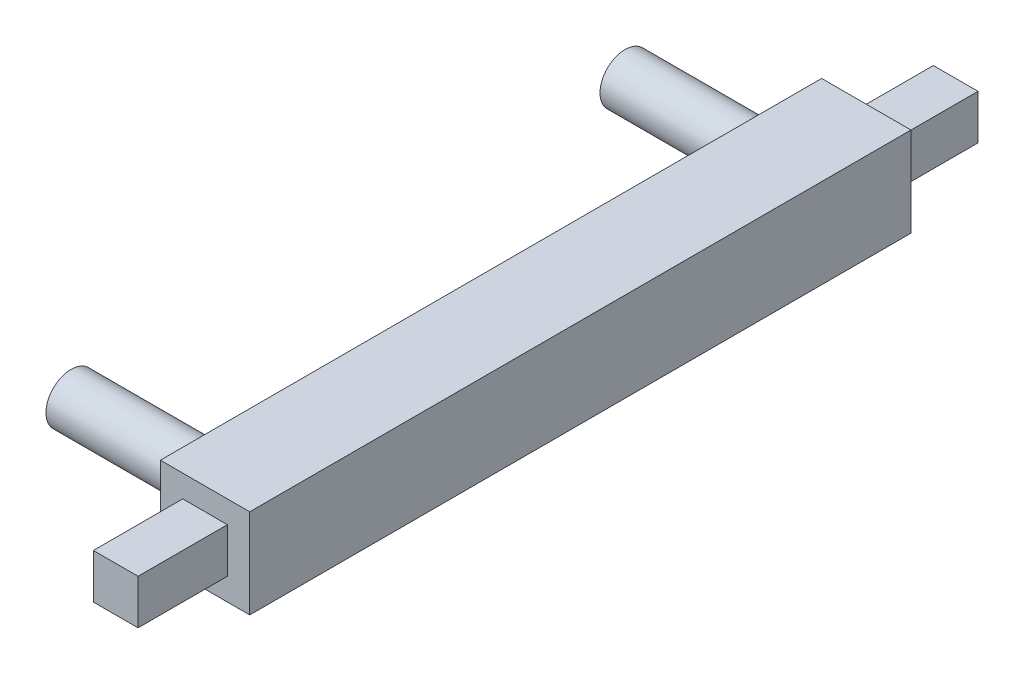
ISO-10303-21;
HEADER;
FILE_DESCRIPTION(('STEP AP214'),'2;1');
FILE_NAME('part.step','',(''),(''),'','','');
FILE_SCHEMA(('AUTOMOTIVE_DESIGN { 1 0 10303 214 1 1 1 1 }'));
ENDSEC;
DATA;
#1=APPLICATION_CONTEXT('core data for automotive mechanical design processes');
#2=APPLICATION_PROTOCOL_DEFINITION('international standard','automotive_design',2000,#1);
#3=PRODUCT_CONTEXT('',#1,'mechanical');
#4=PRODUCT('Part','Part','',(#3));
#5=PRODUCT_RELATED_PRODUCT_CATEGORY('part','',(#4));
#6=PRODUCT_DEFINITION_FORMATION('','',#4);
#7=PRODUCT_DEFINITION_CONTEXT('part definition',#1,'design');
#8=PRODUCT_DEFINITION('design','',#6,#7);
#9=PRODUCT_DEFINITION_SHAPE('','',#8);
#10=(LENGTH_UNIT() NAMED_UNIT(*) SI_UNIT(.MILLI.,.METRE.));
#11=(NAMED_UNIT(*) PLANE_ANGLE_UNIT() SI_UNIT($,.RADIAN.));
#12=(NAMED_UNIT(*) SI_UNIT($,.STERADIAN.) SOLID_ANGLE_UNIT());
#13=UNCERTAINTY_MEASURE_WITH_UNIT(LENGTH_MEASURE(1.E-05),#10,'distance_accuracy_value','');
#14=(GEOMETRIC_REPRESENTATION_CONTEXT(3) GLOBAL_UNCERTAINTY_ASSIGNED_CONTEXT((#13)) GLOBAL_UNIT_ASSIGNED_CONTEXT((#10,
#11,#12)) REPRESENTATION_CONTEXT('',''));
#15=CARTESIAN_POINT('',(0.,0.,0.));
#16=DIRECTION('',(0.,0.,1.));
#17=DIRECTION('',(1.,0.,0.));
#18=AXIS2_PLACEMENT_3D('',#15,#16,#17);
#19=CARTESIAN_POINT('',(0.,0.,37.));
#20=DIRECTION('',(0.,0.,-1.));
#21=DIRECTION('',(-1.,0.,0.));
#22=AXIS2_PLACEMENT_3D('',#19,#20,#21);
#23=PLANE('',#22);
#24=DIRECTION('',(0.,-1.,0.));
#25=VECTOR('',#24,1.);
#26=CARTESIAN_POINT('',(0.,0.,37.));
#27=LINE('',#26,#25);
#28=CARTESIAN_POINT('',(0.,5.,37.));
#29=VERTEX_POINT('',#28);
#30=CARTESIAN_POINT('',(0.,0.,37.));
#31=VERTEX_POINT('',#30);
#32=EDGE_CURVE('E180',#29,#31,#27,.T.);
#33=ORIENTED_EDGE('',*,*,#32,.T.);
#34=DIRECTION('',(1.,0.,0.));
#35=VECTOR('',#34,1.);
#36=CARTESIAN_POINT('',(0.,0.,37.));
#37=LINE('',#36,#35);
#38=CARTESIAN_POINT('',(5.,0.,37.));
#39=VERTEX_POINT('',#38);
#40=EDGE_CURVE('E183',#31,#39,#37,.T.);
#41=ORIENTED_EDGE('',*,*,#40,.T.);
#42=DIRECTION('',(0.,1.,0.));
#43=VECTOR('',#42,1.);
#44=CARTESIAN_POINT('',(5.,0.,37.));
#45=LINE('',#44,#43);
#46=CARTESIAN_POINT('',(5.,5.,37.));
#47=VERTEX_POINT('',#46);
#48=EDGE_CURVE('E186',#39,#47,#45,.T.);
#49=ORIENTED_EDGE('',*,*,#48,.T.);
#50=DIRECTION('',(-1.,0.,0.));
#51=VECTOR('',#50,1.);
#52=CARTESIAN_POINT('',(0.,5.,37.));
#53=LINE('',#52,#51);
#54=EDGE_CURVE('E188',#47,#29,#53,.T.);
#55=ORIENTED_EDGE('',*,*,#54,.T.);
#56=EDGE_LOOP('',(#33,#41,#49,#55));
#57=FACE_BOUND('',#56,.T.);
#58=DIRECTION('',(0.,-1.,0.));
#59=VECTOR('',#58,1.);
#60=CARTESIAN_POINT('',(1.25,1.25,37.));
#61=LINE('',#60,#59);
#62=CARTESIAN_POINT('',(1.25,3.75,37.));
#63=VERTEX_POINT('',#62);
#64=CARTESIAN_POINT('',(1.25,1.25,37.));
#65=VERTEX_POINT('',#64);
#66=EDGE_CURVE('E141',#63,#65,#61,.T.);
#67=ORIENTED_EDGE('',*,*,#66,.F.);
#68=DIRECTION('',(-1.,0.,0.));
#69=VECTOR('',#68,1.);
#70=CARTESIAN_POINT('',(1.25,3.75,37.));
#71=LINE('',#70,#69);
#72=CARTESIAN_POINT('',(3.75,3.75,37.));
#73=VERTEX_POINT('',#72);
#74=EDGE_CURVE('E154',#73,#63,#71,.T.);
#75=ORIENTED_EDGE('',*,*,#74,.F.);
#76=DIRECTION('',(0.,1.,0.));
#77=VECTOR('',#76,1.);
#78=CARTESIAN_POINT('',(3.75,1.25,37.));
#79=LINE('',#78,#77);
#80=CARTESIAN_POINT('',(3.75,1.25,37.));
#81=VERTEX_POINT('',#80);
#82=EDGE_CURVE('E163',#81,#73,#79,.T.);
#83=ORIENTED_EDGE('',*,*,#82,.F.);
#84=DIRECTION('',(1.,0.,0.));
#85=VECTOR('',#84,1.);
#86=CARTESIAN_POINT('',(1.25,1.25,37.));
#87=LINE('',#86,#85);
#88=EDGE_CURVE('E144',#65,#81,#87,.T.);
#89=ORIENTED_EDGE('',*,*,#88,.F.);
#90=EDGE_LOOP('',(#67,#75,#83,#89));
#91=FACE_BOUND('',#90,.T.);
#92=ADVANCED_FACE('F32',(#57,#91),#23,.F.);
#93=CARTESIAN_POINT('',(0.,0.,37.));
#94=DIRECTION('',(1.,0.,0.));
#95=DIRECTION('',(0.,0.,-1.));
#96=AXIS2_PLACEMENT_3D('',#93,#94,#95);
#97=PLANE('',#96);
#98=CARTESIAN_POINT('',(0.,2.5,34.));
#99=DIRECTION('',(1.,0.,0.));
#100=DIRECTION('',(0.,0.,-1.));
#101=AXIS2_PLACEMENT_3D('',#98,#99,#100);
#102=CIRCLE('',#101,1.4);
#103=CARTESIAN_POINT('',(0.,2.5,32.6));
#104=VERTEX_POINT('',#103);
#105=EDGE_CURVE('E11',#104,#104,#102,.F.);
#106=ORIENTED_EDGE('',*,*,#105,.F.);
#107=EDGE_LOOP('',(#106));
#108=FACE_BOUND('',#107,.T.);
#109=CARTESIAN_POINT('',(0.,2.5,3.));
#110=DIRECTION('',(1.,0.,0.));
#111=DIRECTION('',(0.,0.,-1.));
#112=AXIS2_PLACEMENT_3D('',#109,#110,#111);
#113=CIRCLE('',#112,1.4);
#114=CARTESIAN_POINT('',(0.,2.5,1.6));
#115=VERTEX_POINT('',#114);
#116=EDGE_CURVE('E40',#115,#115,#113,.F.);
#117=ORIENTED_EDGE('',*,*,#116,.F.);
#118=EDGE_LOOP('',(#117));
#119=FACE_BOUND('',#118,.T.);
#120=DIRECTION('',(0.,-1.,0.));
#121=VECTOR('',#120,1.);
#122=CARTESIAN_POINT('',(0.,0.,0.));
#123=LINE('',#122,#121);
#124=CARTESIAN_POINT('',(0.,5.,0.));
#125=VERTEX_POINT('',#124);
#126=CARTESIAN_POINT('',(0.,0.,0.));
#127=VERTEX_POINT('',#126);
#128=EDGE_CURVE('E179',#125,#127,#123,.T.);
#129=ORIENTED_EDGE('',*,*,#128,.T.);
#130=DIRECTION('',(0.,0.,-1.));
#131=VECTOR('',#130,1.);
#132=CARTESIAN_POINT('',(0.,0.,37.));
#133=LINE('',#132,#131);
#134=EDGE_CURVE('E206',#31,#127,#133,.T.);
#135=ORIENTED_EDGE('',*,*,#134,.F.);
#136=ORIENTED_EDGE('',*,*,#32,.F.);
#137=DIRECTION('',(0.,0.,-1.));
#138=VECTOR('',#137,1.);
#139=CARTESIAN_POINT('',(0.,5.,37.));
#140=LINE('',#139,#138);
#141=EDGE_CURVE('E190',#29,#125,#140,.T.);
#142=ORIENTED_EDGE('',*,*,#141,.T.);
#143=EDGE_LOOP('',(#129,#135,#136,#142));
#144=FACE_BOUND('',#143,.T.);
#145=ADVANCED_FACE('F34',(#108,#119,#144),#97,.F.);
#146=CARTESIAN_POINT('',(0.,0.,37.));
#147=DIRECTION('',(0.,1.,0.));
#148=DIRECTION('',(0.,0.,1.));
#149=AXIS2_PLACEMENT_3D('',#146,#147,#148);
#150=PLANE('',#149);
#151=DIRECTION('',(1.,0.,0.));
#152=VECTOR('',#151,1.);
#153=CARTESIAN_POINT('',(0.,0.,0.));
#154=LINE('',#153,#152);
#155=CARTESIAN_POINT('',(5.,0.,0.));
#156=VERTEX_POINT('',#155);
#157=EDGE_CURVE('E193',#127,#156,#154,.T.);
#158=ORIENTED_EDGE('',*,*,#157,.T.);
#159=DIRECTION('',(0.,0.,-1.));
#160=VECTOR('',#159,1.);
#161=CARTESIAN_POINT('',(5.,0.,37.));
#162=LINE('',#161,#160);
#163=EDGE_CURVE('E203',#39,#156,#162,.T.);
#164=ORIENTED_EDGE('',*,*,#163,.F.);
#165=ORIENTED_EDGE('',*,*,#40,.F.);
#166=ORIENTED_EDGE('',*,*,#134,.T.);
#167=EDGE_LOOP('',(#158,#164,#165,#166));
#168=FACE_BOUND('',#167,.T.);
#169=ADVANCED_FACE('F215',(#168),#150,.F.);
#170=CARTESIAN_POINT('',(5.,0.,37.));
#171=DIRECTION('',(-1.,0.,0.));
#172=DIRECTION('',(0.,0.,1.));
#173=AXIS2_PLACEMENT_3D('',#170,#171,#172);
#174=PLANE('',#173);
#175=DIRECTION('',(0.,1.,0.));
#176=VECTOR('',#175,1.);
#177=CARTESIAN_POINT('',(5.,0.,0.));
#178=LINE('',#177,#176);
#179=CARTESIAN_POINT('',(5.,5.,0.));
#180=VERTEX_POINT('',#179);
#181=EDGE_CURVE('E195',#156,#180,#178,.T.);
#182=ORIENTED_EDGE('',*,*,#181,.T.);
#183=DIRECTION('',(0.,0.,-1.));
#184=VECTOR('',#183,1.);
#185=CARTESIAN_POINT('',(5.,5.,37.));
#186=LINE('',#185,#184);
#187=EDGE_CURVE('E200',#47,#180,#186,.T.);
#188=ORIENTED_EDGE('',*,*,#187,.F.);
#189=ORIENTED_EDGE('',*,*,#48,.F.);
#190=ORIENTED_EDGE('',*,*,#163,.T.);
#191=EDGE_LOOP('',(#182,#188,#189,#190));
#192=FACE_BOUND('',#191,.T.);
#193=ADVANCED_FACE('F235',(#192),#174,.F.);
#194=CARTESIAN_POINT('',(0.,5.,37.));
#195=DIRECTION('',(0.,-1.,0.));
#196=DIRECTION('',(0.,0.,-1.));
#197=AXIS2_PLACEMENT_3D('',#194,#195,#196);
#198=PLANE('',#197);
#199=DIRECTION('',(-1.,0.,0.));
#200=VECTOR('',#199,1.);
#201=CARTESIAN_POINT('',(0.,5.,0.));
#202=LINE('',#201,#200);
#203=EDGE_CURVE('E184',#180,#125,#202,.T.);
#204=ORIENTED_EDGE('',*,*,#203,.T.);
#205=ORIENTED_EDGE('',*,*,#141,.F.);
#206=ORIENTED_EDGE('',*,*,#54,.F.);
#207=ORIENTED_EDGE('',*,*,#187,.T.);
#208=EDGE_LOOP('',(#204,#205,#206,#207));
#209=FACE_BOUND('',#208,.T.);
#210=ADVANCED_FACE('F233',(#209),#198,.F.);
#211=CARTESIAN_POINT('',(0.,0.,0.));
#212=DIRECTION('',(0.,0.,-1.));
#213=DIRECTION('',(-1.,0.,0.));
#214=AXIS2_PLACEMENT_3D('',#211,#212,#213);
#215=PLANE('',#214);
#216=DIRECTION('',(0.,-1.,0.));
#217=VECTOR('',#216,1.);
#218=CARTESIAN_POINT('',(3.75,1.25,0.));
#219=LINE('',#218,#217);
#220=CARTESIAN_POINT('',(3.75,3.75,0.));
#221=VERTEX_POINT('',#220);
#222=CARTESIAN_POINT('',(3.75,1.25,0.));
#223=VERTEX_POINT('',#222);
#224=EDGE_CURVE('E47',#221,#223,#219,.T.);
#225=ORIENTED_EDGE('',*,*,#224,.F.);
#226=DIRECTION('',(1.,0.,0.));
#227=VECTOR('',#226,1.);
#228=CARTESIAN_POINT('',(3.75,3.75,0.));
#229=LINE('',#228,#227);
#230=CARTESIAN_POINT('',(1.25,3.75,0.));
#231=VERTEX_POINT('',#230);
#232=EDGE_CURVE('E51',#231,#221,#229,.T.);
#233=ORIENTED_EDGE('',*,*,#232,.F.);
#234=DIRECTION('',(0.,1.,0.));
#235=VECTOR('',#234,1.);
#236=CARTESIAN_POINT('',(1.25,1.25,0.));
#237=LINE('',#236,#235);
#238=CARTESIAN_POINT('',(1.25,1.25,0.));
#239=VERTEX_POINT('',#238);
#240=EDGE_CURVE('E397',#239,#231,#237,.T.);
#241=ORIENTED_EDGE('',*,*,#240,.F.);
#242=DIRECTION('',(-1.,0.,0.));
#243=VECTOR('',#242,1.);
#244=CARTESIAN_POINT('',(3.75,1.25,0.));
#245=LINE('',#244,#243);
#246=EDGE_CURVE('E395',#223,#239,#245,.T.);
#247=ORIENTED_EDGE('',*,*,#246,.F.);
#248=EDGE_LOOP('',(#225,#233,#241,#247));
#249=FACE_BOUND('',#248,.T.);
#250=ORIENTED_EDGE('',*,*,#128,.F.);
#251=ORIENTED_EDGE('',*,*,#203,.F.);
#252=ORIENTED_EDGE('',*,*,#181,.F.);
#253=ORIENTED_EDGE('',*,*,#157,.F.);
#254=EDGE_LOOP('',(#250,#251,#252,#253));
#255=FACE_BOUND('',#254,.T.);
#256=ADVANCED_FACE('F223',(#249,#255),#215,.T.);
#257=CARTESIAN_POINT('',(1.25,1.25,42.));
#258=DIRECTION('',(1.,0.,0.));
#259=DIRECTION('',(0.,0.,-1.));
#260=AXIS2_PLACEMENT_3D('',#257,#258,#259);
#261=PLANE('',#260);
#262=ORIENTED_EDGE('',*,*,#66,.T.);
#263=DIRECTION('',(0.,0.,-1.));
#264=VECTOR('',#263,1.);
#265=CARTESIAN_POINT('',(1.25,1.25,42.));
#266=LINE('',#265,#264);
#267=CARTESIAN_POINT('',(1.25,1.25,42.));
#268=VERTEX_POINT('',#267);
#269=EDGE_CURVE('E176',#268,#65,#266,.T.);
#270=ORIENTED_EDGE('',*,*,#269,.F.);
#271=DIRECTION('',(0.,-1.,0.));
#272=VECTOR('',#271,1.);
#273=CARTESIAN_POINT('',(1.25,1.25,42.));
#274=LINE('',#273,#272);
#275=CARTESIAN_POINT('',(1.25,3.75,42.));
#276=VERTEX_POINT('',#275);
#277=EDGE_CURVE('E150',#276,#268,#274,.T.);
#278=ORIENTED_EDGE('',*,*,#277,.F.);
#279=DIRECTION('',(0.,0.,-1.));
#280=VECTOR('',#279,1.);
#281=CARTESIAN_POINT('',(1.25,3.75,42.));
#282=LINE('',#281,#280);
#283=EDGE_CURVE('E159',#276,#63,#282,.T.);
#284=ORIENTED_EDGE('',*,*,#283,.T.);
#285=EDGE_LOOP('',(#262,#270,#278,#284));
#286=FACE_BOUND('',#285,.T.);
#287=ADVANCED_FACE('F251',(#286),#261,.F.);
#288=CARTESIAN_POINT('',(1.25,1.25,42.));
#289=DIRECTION('',(0.,1.,0.));
#290=DIRECTION('',(0.,0.,1.));
#291=AXIS2_PLACEMENT_3D('',#288,#289,#290);
#292=PLANE('',#291);
#293=ORIENTED_EDGE('',*,*,#88,.T.);
#294=DIRECTION('',(0.,0.,-1.));
#295=VECTOR('',#294,1.);
#296=CARTESIAN_POINT('',(3.75,1.25,42.));
#297=LINE('',#296,#295);
#298=CARTESIAN_POINT('',(3.75,1.25,42.));
#299=VERTEX_POINT('',#298);
#300=EDGE_CURVE('E173',#299,#81,#297,.T.);
#301=ORIENTED_EDGE('',*,*,#300,.F.);
#302=DIRECTION('',(1.,0.,0.));
#303=VECTOR('',#302,1.);
#304=CARTESIAN_POINT('',(1.25,1.25,42.));
#305=LINE('',#304,#303);
#306=EDGE_CURVE('E153',#268,#299,#305,.T.);
#307=ORIENTED_EDGE('',*,*,#306,.F.);
#308=ORIENTED_EDGE('',*,*,#269,.T.);
#309=EDGE_LOOP('',(#293,#301,#307,#308));
#310=FACE_BOUND('',#309,.T.);
#311=ADVANCED_FACE('F259',(#310),#292,.F.);
#312=CARTESIAN_POINT('',(3.75,1.25,42.));
#313=DIRECTION('',(-1.,0.,0.));
#314=DIRECTION('',(0.,0.,1.));
#315=AXIS2_PLACEMENT_3D('',#312,#313,#314);
#316=PLANE('',#315);
#317=ORIENTED_EDGE('',*,*,#82,.T.);
#318=DIRECTION('',(0.,0.,-1.));
#319=VECTOR('',#318,1.);
#320=CARTESIAN_POINT('',(3.75,3.75,42.));
#321=LINE('',#320,#319);
#322=CARTESIAN_POINT('',(3.75,3.75,42.));
#323=VERTEX_POINT('',#322);
#324=EDGE_CURVE('E170',#323,#73,#321,.T.);
#325=ORIENTED_EDGE('',*,*,#324,.F.);
#326=DIRECTION('',(0.,1.,0.));
#327=VECTOR('',#326,1.);
#328=CARTESIAN_POINT('',(3.75,1.25,42.));
#329=LINE('',#328,#327);
#330=EDGE_CURVE('E156',#299,#323,#329,.T.);
#331=ORIENTED_EDGE('',*,*,#330,.F.);
#332=ORIENTED_EDGE('',*,*,#300,.T.);
#333=EDGE_LOOP('',(#317,#325,#331,#332));
#334=FACE_BOUND('',#333,.T.);
#335=ADVANCED_FACE('F264',(#334),#316,.F.);
#336=CARTESIAN_POINT('',(1.25,3.75,42.));
#337=DIRECTION('',(0.,-1.,0.));
#338=DIRECTION('',(0.,0.,-1.));
#339=AXIS2_PLACEMENT_3D('',#336,#337,#338);
#340=PLANE('',#339);
#341=ORIENTED_EDGE('',*,*,#74,.T.);
#342=ORIENTED_EDGE('',*,*,#283,.F.);
#343=DIRECTION('',(-1.,0.,0.));
#344=VECTOR('',#343,1.);
#345=CARTESIAN_POINT('',(1.25,3.75,42.));
#346=LINE('',#345,#344);
#347=EDGE_CURVE('E158',#323,#276,#346,.T.);
#348=ORIENTED_EDGE('',*,*,#347,.F.);
#349=ORIENTED_EDGE('',*,*,#324,.T.);
#350=EDGE_LOOP('',(#341,#342,#348,#349));
#351=FACE_BOUND('',#350,.T.);
#352=ADVANCED_FACE('F270',(#351),#340,.F.);
#353=CARTESIAN_POINT('',(0.,0.,42.));
#354=DIRECTION('',(0.,0.,-1.));
#355=DIRECTION('',(-1.,0.,0.));
#356=AXIS2_PLACEMENT_3D('',#353,#354,#355);
#357=PLANE('',#356);
#358=ORIENTED_EDGE('',*,*,#277,.T.);
#359=ORIENTED_EDGE('',*,*,#306,.T.);
#360=ORIENTED_EDGE('',*,*,#330,.T.);
#361=ORIENTED_EDGE('',*,*,#347,.T.);
#362=EDGE_LOOP('',(#358,#359,#360,#361));
#363=FACE_BOUND('',#362,.T.);
#364=ADVANCED_FACE('F277',(#363),#357,.F.);
#365=CARTESIAN_POINT('',(3.75,1.25,-5.));
#366=DIRECTION('',(-1.,0.,0.));
#367=DIRECTION('',(0.,0.,1.));
#368=AXIS2_PLACEMENT_3D('',#365,#366,#367);
#369=PLANE('',#368);
#370=ORIENTED_EDGE('',*,*,#224,.T.);
#371=DIRECTION('',(0.,0.,1.));
#372=VECTOR('',#371,1.);
#373=CARTESIAN_POINT('',(3.75,1.25,-5.));
#374=LINE('',#373,#372);
#375=CARTESIAN_POINT('',(3.75,1.25,-5.));
#376=VERTEX_POINT('',#375);
#377=EDGE_CURVE('E124',#376,#223,#374,.T.);
#378=ORIENTED_EDGE('',*,*,#377,.F.);
#379=DIRECTION('',(0.,-1.,0.));
#380=VECTOR('',#379,1.);
#381=CARTESIAN_POINT('',(3.75,1.25,-5.));
#382=LINE('',#381,#380);
#383=CARTESIAN_POINT('',(3.75,3.75,-5.));
#384=VERTEX_POINT('',#383);
#385=EDGE_CURVE('E130',#384,#376,#382,.T.);
#386=ORIENTED_EDGE('',*,*,#385,.F.);
#387=DIRECTION('',(0.,0.,1.));
#388=VECTOR('',#387,1.);
#389=CARTESIAN_POINT('',(3.75,3.75,-5.));
#390=LINE('',#389,#388);
#391=EDGE_CURVE('E393',#384,#221,#390,.T.);
#392=ORIENTED_EDGE('',*,*,#391,.T.);
#393=EDGE_LOOP('',(#370,#378,#386,#392));
#394=FACE_BOUND('',#393,.T.);
#395=ADVANCED_FACE('F140',(#394),#369,.F.);
#396=CARTESIAN_POINT('',(3.75,1.25,-5.));
#397=DIRECTION('',(0.,1.,0.));
#398=DIRECTION('',(0.,0.,1.));
#399=AXIS2_PLACEMENT_3D('',#396,#397,#398);
#400=PLANE('',#399);
#401=ORIENTED_EDGE('',*,*,#246,.T.);
#402=DIRECTION('',(0.,0.,1.));
#403=VECTOR('',#402,1.);
#404=CARTESIAN_POINT('',(1.25,1.25,-5.));
#405=LINE('',#404,#403);
#406=CARTESIAN_POINT('',(1.25,1.25,-5.));
#407=VERTEX_POINT('',#406);
#408=EDGE_CURVE('E126',#407,#239,#405,.T.);
#409=ORIENTED_EDGE('',*,*,#408,.F.);
#410=DIRECTION('',(-1.,0.,0.));
#411=VECTOR('',#410,1.);
#412=CARTESIAN_POINT('',(3.75,1.25,-5.));
#413=LINE('',#412,#411);
#414=EDGE_CURVE('E119',#376,#407,#413,.T.);
#415=ORIENTED_EDGE('',*,*,#414,.F.);
#416=ORIENTED_EDGE('',*,*,#377,.T.);
#417=EDGE_LOOP('',(#401,#409,#415,#416));
#418=FACE_BOUND('',#417,.T.);
#419=ADVANCED_FACE('F122',(#418),#400,.F.);
#420=CARTESIAN_POINT('',(1.25,1.25,-5.));
#421=DIRECTION('',(1.,0.,0.));
#422=DIRECTION('',(0.,0.,-1.));
#423=AXIS2_PLACEMENT_3D('',#420,#421,#422);
#424=PLANE('',#423);
#425=ORIENTED_EDGE('',*,*,#240,.T.);
#426=DIRECTION('',(0.,0.,1.));
#427=VECTOR('',#426,1.);
#428=CARTESIAN_POINT('',(1.25,3.75,-5.));
#429=LINE('',#428,#427);
#430=CARTESIAN_POINT('',(1.25,3.75,-5.));
#431=VERTEX_POINT('',#430);
#432=EDGE_CURVE('E146',#431,#231,#429,.T.);
#433=ORIENTED_EDGE('',*,*,#432,.F.);
#434=DIRECTION('',(0.,1.,0.));
#435=VECTOR('',#434,1.);
#436=CARTESIAN_POINT('',(1.25,1.25,-5.));
#437=LINE('',#436,#435);
#438=EDGE_CURVE('E129',#407,#431,#437,.T.);
#439=ORIENTED_EDGE('',*,*,#438,.F.);
#440=ORIENTED_EDGE('',*,*,#408,.T.);
#441=EDGE_LOOP('',(#425,#433,#439,#440));
#442=FACE_BOUND('',#441,.T.);
#443=ADVANCED_FACE('F314',(#442),#424,.F.);
#444=CARTESIAN_POINT('',(3.75,3.75,-5.));
#445=DIRECTION('',(0.,-1.,0.));
#446=DIRECTION('',(0.,0.,-1.));
#447=AXIS2_PLACEMENT_3D('',#444,#445,#446);
#448=PLANE('',#447);
#449=ORIENTED_EDGE('',*,*,#232,.T.);
#450=ORIENTED_EDGE('',*,*,#391,.F.);
#451=DIRECTION('',(1.,0.,0.));
#452=VECTOR('',#451,1.);
#453=CARTESIAN_POINT('',(3.75,3.75,-5.));
#454=LINE('',#453,#452);
#455=EDGE_CURVE('E135',#431,#384,#454,.T.);
#456=ORIENTED_EDGE('',*,*,#455,.F.);
#457=ORIENTED_EDGE('',*,*,#432,.T.);
#458=EDGE_LOOP('',(#449,#450,#456,#457));
#459=FACE_BOUND('',#458,.T.);
#460=ADVANCED_FACE('F321',(#459),#448,.F.);
#461=CARTESIAN_POINT('',(0.,0.,-5.));
#462=DIRECTION('',(0.,0.,1.));
#463=DIRECTION('',(1.,0.,0.));
#464=AXIS2_PLACEMENT_3D('',#461,#462,#463);
#465=PLANE('',#464);
#466=ORIENTED_EDGE('',*,*,#385,.T.);
#467=ORIENTED_EDGE('',*,*,#414,.T.);
#468=ORIENTED_EDGE('',*,*,#438,.T.);
#469=ORIENTED_EDGE('',*,*,#455,.T.);
#470=EDGE_LOOP('',(#466,#467,#468,#469));
#471=FACE_BOUND('',#470,.T.);
#472=ADVANCED_FACE('F133',(#471),#465,.F.);
#473=CARTESIAN_POINT('',(-8.,2.5,3.));
#474=DIRECTION('',(1.,0.,0.));
#475=DIRECTION('',(0.,0.,-1.));
#476=AXIS2_PLACEMENT_3D('',#473,#474,#475);
#477=CYLINDRICAL_SURFACE('',#476,1.4);
#478=CARTESIAN_POINT('',(-8.,2.5,3.));
#479=DIRECTION('',(-1.,0.,0.));
#480=DIRECTION('',(0.,0.,1.));
#481=AXIS2_PLACEMENT_3D('',#478,#479,#480);
#482=CIRCLE('',#481,1.4);
#483=CARTESIAN_POINT('',(-8.,2.5,4.4));
#484=VERTEX_POINT('',#483);
#485=EDGE_CURVE('E386',#484,#484,#482,.T.);
#486=ORIENTED_EDGE('',*,*,#485,.F.);
#487=EDGE_LOOP('',(#486));
#488=FACE_BOUND('',#487,.T.);
#489=ORIENTED_EDGE('',*,*,#116,.T.);
#490=EDGE_LOOP('',(#489));
#491=FACE_BOUND('',#490,.T.);
#492=ADVANCED_FACE('F211',(#488,#491),#477,.T.);
#493=CARTESIAN_POINT('',(-8.,2.5,3.));
#494=DIRECTION('',(-1.,0.,0.));
#495=DIRECTION('',(0.,0.,1.));
#496=AXIS2_PLACEMENT_3D('',#493,#494,#495);
#497=PLANE('',#496);
#498=ORIENTED_EDGE('',*,*,#485,.T.);
#499=EDGE_LOOP('',(#498));
#500=FACE_BOUND('',#499,.T.);
#501=ADVANCED_FACE('F345',(#500),#497,.T.);
#502=CARTESIAN_POINT('',(-8.,2.5,34.));
#503=DIRECTION('',(1.,0.,0.));
#504=DIRECTION('',(0.,0.,-1.));
#505=AXIS2_PLACEMENT_3D('',#502,#503,#504);
#506=CYLINDRICAL_SURFACE('',#505,1.4);
#507=CARTESIAN_POINT('',(-8.,2.5,34.));
#508=DIRECTION('',(-1.,0.,0.));
#509=DIRECTION('',(0.,0.,1.));
#510=AXIS2_PLACEMENT_3D('',#507,#508,#509);
#511=CIRCLE('',#510,1.4);
#512=CARTESIAN_POINT('',(-8.,2.5,35.4));
#513=VERTEX_POINT('',#512);
#514=EDGE_CURVE('E385',#513,#513,#511,.T.);
#515=ORIENTED_EDGE('',*,*,#514,.F.);
#516=EDGE_LOOP('',(#515));
#517=FACE_BOUND('',#516,.T.);
#518=ORIENTED_EDGE('',*,*,#105,.T.);
#519=EDGE_LOOP('',(#518));
#520=FACE_BOUND('',#519,.T.);
#521=ADVANCED_FACE('F354',(#517,#520),#506,.T.);
#522=CARTESIAN_POINT('',(-8.,2.5,34.));
#523=DIRECTION('',(-1.,0.,0.));
#524=DIRECTION('',(0.,0.,1.));
#525=AXIS2_PLACEMENT_3D('',#522,#523,#524);
#526=PLANE('',#525);
#527=ORIENTED_EDGE('',*,*,#514,.T.);
#528=EDGE_LOOP('',(#527));
#529=FACE_BOUND('',#528,.T.);
#530=ADVANCED_FACE('F363',(#529),#526,.T.);
#531=CLOSED_SHELL('',(#92,#145,#169,#193,#210,#256,#287,#311,#335,#352,#364,#395,#419,#443,#460,
#472,#492,#501,#521,#530));
#532=MANIFOLD_SOLID_BREP('B2',#531);
#533=ADVANCED_BREP_SHAPE_REPRESENTATION('',(#18,#532),#14);
#534=SHAPE_DEFINITION_REPRESENTATION(#9,#533);
ENDSEC;
END-ISO-10303-21;
